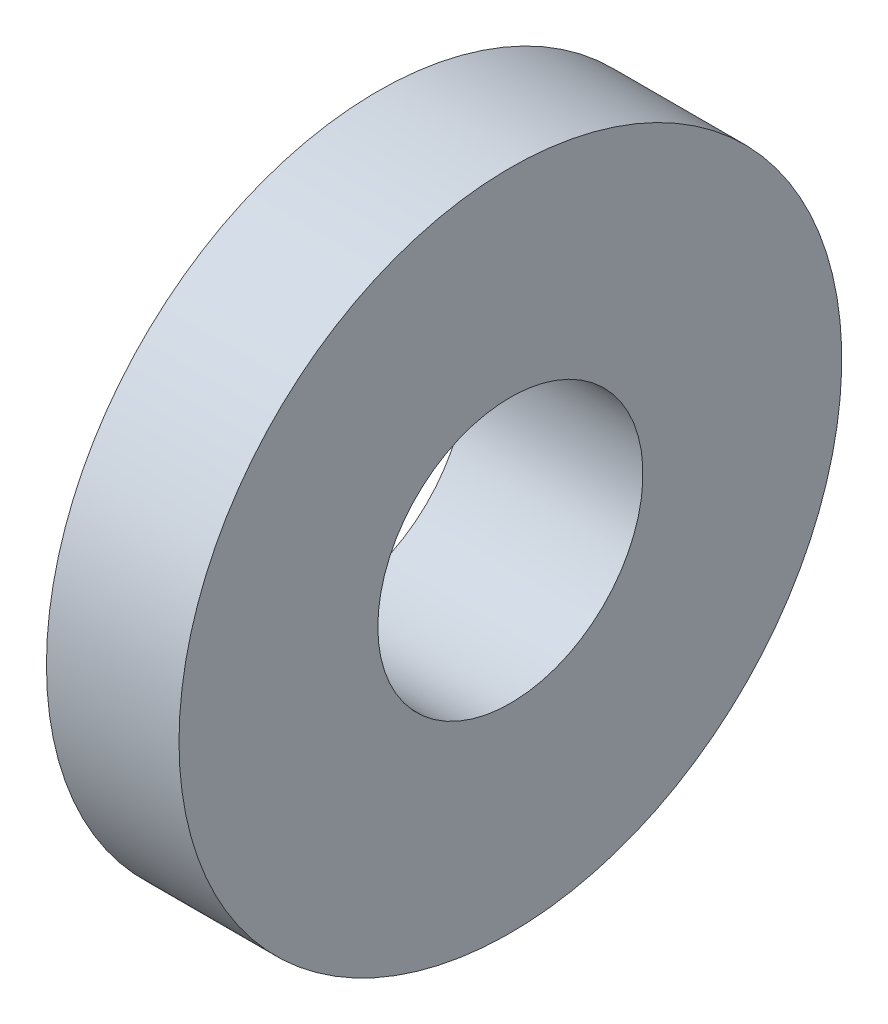
ISO-10303-21;
HEADER;
FILE_DESCRIPTION(('STEP AP214'),'2;1');
FILE_NAME('part.step','',(''),(''),'','','');
FILE_SCHEMA(('AUTOMOTIVE_DESIGN { 1 0 10303 214 1 1 1 1 }'));
ENDSEC;
DATA;
#1=APPLICATION_CONTEXT('core data for automotive mechanical design processes');
#2=APPLICATION_PROTOCOL_DEFINITION('international standard','automotive_design',2000,#1);
#3=PRODUCT_CONTEXT('',#1,'mechanical');
#4=PRODUCT('Part','Part','',(#3));
#5=PRODUCT_RELATED_PRODUCT_CATEGORY('part','',(#4));
#6=PRODUCT_DEFINITION_FORMATION('','',#4);
#7=PRODUCT_DEFINITION_CONTEXT('part definition',#1,'design');
#8=PRODUCT_DEFINITION('design','',#6,#7);
#9=PRODUCT_DEFINITION_SHAPE('','',#8);
#10=(LENGTH_UNIT() NAMED_UNIT(*) SI_UNIT(.MILLI.,.METRE.));
#11=(NAMED_UNIT(*) PLANE_ANGLE_UNIT() SI_UNIT($,.RADIAN.));
#12=(NAMED_UNIT(*) SI_UNIT($,.STERADIAN.) SOLID_ANGLE_UNIT());
#13=UNCERTAINTY_MEASURE_WITH_UNIT(LENGTH_MEASURE(1.E-05),#10,'distance_accuracy_value','');
#14=(GEOMETRIC_REPRESENTATION_CONTEXT(3) GLOBAL_UNCERTAINTY_ASSIGNED_CONTEXT((#13)) GLOBAL_UNIT_ASSIGNED_CONTEXT((#10,
#11,#12)) REPRESENTATION_CONTEXT('',''));
#15=CARTESIAN_POINT('',(0.,0.,0.));
#16=DIRECTION('',(0.,0.,1.));
#17=DIRECTION('',(1.,0.,0.));
#18=AXIS2_PLACEMENT_3D('',#15,#16,#17);
#19=CARTESIAN_POINT('',(0.,1.5,0.));
#20=DIRECTION('',(1.,0.,0.));
#21=DIRECTION('',(0.,0.,-1.));
#22=AXIS2_PLACEMENT_3D('',#19,#20,#21);
#23=PLANE('',#22);
#24=CARTESIAN_POINT('',(0.,0.,0.));
#25=DIRECTION('',(-1.,0.,0.));
#26=DIRECTION('',(0.,0.,1.));
#27=AXIS2_PLACEMENT_3D('',#24,#25,#26);
#28=CIRCLE('',#27,1.5);
#29=CARTESIAN_POINT('',(0.,0.,1.5));
#30=VERTEX_POINT('',#29);
#31=EDGE_CURVE('E63',#30,#30,#28,.T.);
#32=ORIENTED_EDGE('',*,*,#31,.F.);
#33=EDGE_LOOP('',(#32));
#34=FACE_BOUND('',#33,.T.);
#35=CARTESIAN_POINT('',(0.,0.,0.));
#36=DIRECTION('',(-1.,0.,0.));
#37=DIRECTION('',(0.,0.,1.));
#38=AXIS2_PLACEMENT_3D('',#35,#36,#37);
#39=CIRCLE('',#38,2.5);
#40=CARTESIAN_POINT('',(0.,0.,2.5));
#41=VERTEX_POINT('',#40);
#42=EDGE_CURVE('E10',#41,#41,#39,.T.);
#43=ORIENTED_EDGE('',*,*,#42,.T.);
#44=EDGE_LOOP('',(#43));
#45=FACE_BOUND('',#44,.T.);
#46=ADVANCED_FACE('F41',(#34,#45),#23,.F.);
#47=CARTESIAN_POINT('',(0.,0.,0.));
#48=DIRECTION('',(-1.,0.,0.));
#49=DIRECTION('',(0.,0.,1.));
#50=AXIS2_PLACEMENT_3D('',#47,#48,#49);
#51=CYLINDRICAL_SURFACE('',#50,2.5);
#52=ORIENTED_EDGE('',*,*,#42,.F.);
#53=EDGE_LOOP('',(#52));
#54=FACE_BOUND('',#53,.T.);
#55=CARTESIAN_POINT('',(0.5,0.,0.));
#56=DIRECTION('',(-1.,0.,0.));
#57=DIRECTION('',(0.,0.,1.));
#58=AXIS2_PLACEMENT_3D('',#55,#56,#57);
#59=CIRCLE('',#58,2.5);
#60=CARTESIAN_POINT('',(0.5,0.,2.5));
#61=VERTEX_POINT('',#60);
#62=EDGE_CURVE('E47',#61,#61,#59,.T.);
#63=ORIENTED_EDGE('',*,*,#62,.T.);
#64=EDGE_LOOP('',(#63));
#65=FACE_BOUND('',#64,.T.);
#66=ADVANCED_FACE('F70',(#54,#65),#51,.T.);
#67=CARTESIAN_POINT('',(0.5,2.5,0.));
#68=DIRECTION('',(1.,0.,0.));
#69=DIRECTION('',(0.,0.,-1.));
#70=AXIS2_PLACEMENT_3D('',#67,#68,#69);
#71=PLANE('',#70);
#72=ORIENTED_EDGE('',*,*,#62,.F.);
#73=EDGE_LOOP('',(#72));
#74=FACE_BOUND('',#73,.T.);
#75=CARTESIAN_POINT('',(0.5,0.,0.));
#76=DIRECTION('',(-1.,0.,0.));
#77=DIRECTION('',(0.,0.,1.));
#78=AXIS2_PLACEMENT_3D('',#75,#76,#77);
#79=CIRCLE('',#78,3.75);
#80=CARTESIAN_POINT('',(0.5,0.,3.75));
#81=VERTEX_POINT('',#80);
#82=EDGE_CURVE('E51',#81,#81,#79,.T.);
#83=ORIENTED_EDGE('',*,*,#82,.T.);
#84=EDGE_LOOP('',(#83));
#85=FACE_BOUND('',#84,.T.);
#86=ADVANCED_FACE('F74',(#74,#85),#71,.F.);
#87=CARTESIAN_POINT('',(0.,0.,0.));
#88=DIRECTION('',(-1.,0.,0.));
#89=DIRECTION('',(0.,0.,1.));
#90=AXIS2_PLACEMENT_3D('',#87,#88,#89);
#91=CYLINDRICAL_SURFACE('',#90,3.75);
#92=ORIENTED_EDGE('',*,*,#82,.F.);
#93=EDGE_LOOP('',(#92));
#94=FACE_BOUND('',#93,.T.);
#95=CARTESIAN_POINT('',(2.,0.,0.));
#96=DIRECTION('',(-1.,0.,0.));
#97=DIRECTION('',(0.,0.,1.));
#98=AXIS2_PLACEMENT_3D('',#95,#96,#97);
#99=CIRCLE('',#98,3.75);
#100=CARTESIAN_POINT('',(2.,0.,3.75));
#101=VERTEX_POINT('',#100);
#102=EDGE_CURVE('E55',#101,#101,#99,.T.);
#103=ORIENTED_EDGE('',*,*,#102,.T.);
#104=EDGE_LOOP('',(#103));
#105=FACE_BOUND('',#104,.T.);
#106=ADVANCED_FACE('F79',(#94,#105),#91,.T.);
#107=CARTESIAN_POINT('',(2.,3.75,0.));
#108=DIRECTION('',(-1.,0.,0.));
#109=DIRECTION('',(0.,0.,1.));
#110=AXIS2_PLACEMENT_3D('',#107,#108,#109);
#111=PLANE('',#110);
#112=ORIENTED_EDGE('',*,*,#102,.F.);
#113=EDGE_LOOP('',(#112));
#114=FACE_BOUND('',#113,.T.);
#115=CARTESIAN_POINT('',(2.,0.,0.));
#116=DIRECTION('',(-1.,0.,0.));
#117=DIRECTION('',(0.,0.,1.));
#118=AXIS2_PLACEMENT_3D('',#115,#116,#117);
#119=CIRCLE('',#118,1.5);
#120=CARTESIAN_POINT('',(2.,0.,1.5));
#121=VERTEX_POINT('',#120);
#122=EDGE_CURVE('E60',#121,#121,#119,.T.);
#123=ORIENTED_EDGE('',*,*,#122,.T.);
#124=EDGE_LOOP('',(#123));
#125=FACE_BOUND('',#124,.T.);
#126=ADVANCED_FACE('F85',(#114,#125),#111,.F.);
#127=CARTESIAN_POINT('',(0.,0.,0.));
#128=DIRECTION('',(-1.,0.,0.));
#129=DIRECTION('',(0.,0.,1.));
#130=AXIS2_PLACEMENT_3D('',#127,#128,#129);
#131=CYLINDRICAL_SURFACE('',#130,1.5);
#132=ORIENTED_EDGE('',*,*,#122,.F.);
#133=EDGE_LOOP('',(#132));
#134=FACE_BOUND('',#133,.T.);
#135=ORIENTED_EDGE('',*,*,#31,.T.);
#136=EDGE_LOOP('',(#135));
#137=FACE_BOUND('',#136,.T.);
#138=ADVANCED_FACE('F67',(#134,#137),#131,.F.);
#139=CLOSED_SHELL('',(#46,#66,#86,#106,#126,#138));
#140=MANIFOLD_SOLID_BREP('B2',#139);
#141=ADVANCED_BREP_SHAPE_REPRESENTATION('',(#18,#140),#14);
#142=SHAPE_DEFINITION_REPRESENTATION(#9,#141);
ENDSEC;
END-ISO-10303-21;
